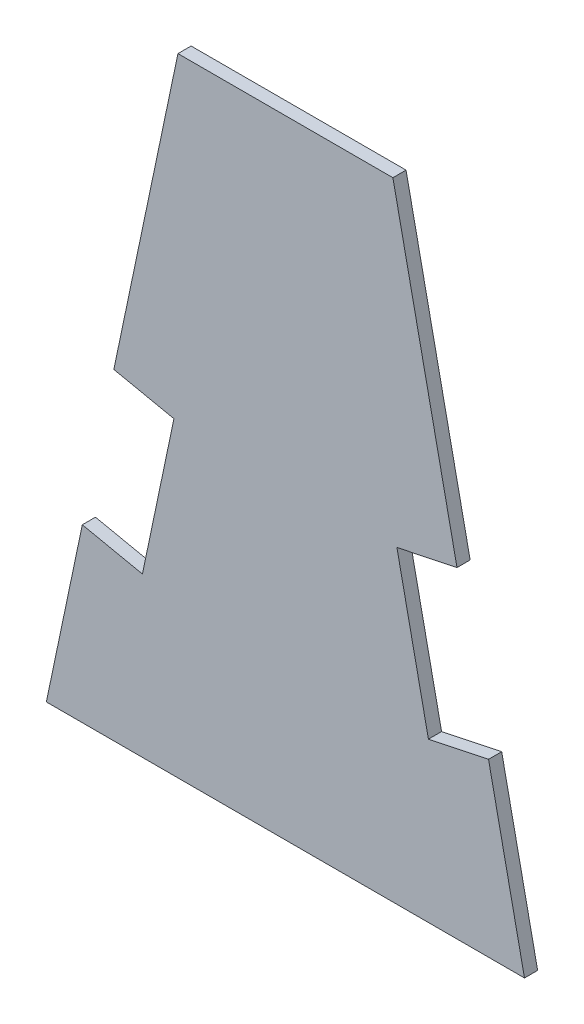
ISO-10303-21;
HEADER;
FILE_DESCRIPTION(('STEP AP214'),'2;1');
FILE_NAME('part.step','',(''),(''),'','','');
FILE_SCHEMA(('AUTOMOTIVE_DESIGN { 1 0 10303 214 1 1 1 1 }'));
ENDSEC;
DATA;
#1=APPLICATION_CONTEXT('core data for automotive mechanical design processes');
#2=APPLICATION_PROTOCOL_DEFINITION('international standard','automotive_design',2000,#1);
#3=PRODUCT_CONTEXT('',#1,'mechanical');
#4=PRODUCT('Part','Part','',(#3));
#5=PRODUCT_RELATED_PRODUCT_CATEGORY('part','',(#4));
#6=PRODUCT_DEFINITION_FORMATION('','',#4);
#7=PRODUCT_DEFINITION_CONTEXT('part definition',#1,'design');
#8=PRODUCT_DEFINITION('design','',#6,#7);
#9=PRODUCT_DEFINITION_SHAPE('','',#8);
#10=(LENGTH_UNIT() NAMED_UNIT(*) SI_UNIT(.MILLI.,.METRE.));
#11=(NAMED_UNIT(*) PLANE_ANGLE_UNIT() SI_UNIT($,.RADIAN.));
#12=(NAMED_UNIT(*) SI_UNIT($,.STERADIAN.) SOLID_ANGLE_UNIT());
#13=UNCERTAINTY_MEASURE_WITH_UNIT(LENGTH_MEASURE(1.E-05),#10,'distance_accuracy_value','');
#14=(GEOMETRIC_REPRESENTATION_CONTEXT(3) GLOBAL_UNCERTAINTY_ASSIGNED_CONTEXT((#13)) GLOBAL_UNIT_ASSIGNED_CONTEXT((#10,
#11,#12)) REPRESENTATION_CONTEXT('',''));
#15=CARTESIAN_POINT('',(0.,0.,0.));
#16=DIRECTION('',(0.,0.,1.));
#17=DIRECTION('',(1.,0.,0.));
#18=AXIS2_PLACEMENT_3D('',#15,#16,#17);
#19=CARTESIAN_POINT('',(79.9136019874139,70.4591111968738,3.));
#20=DIRECTION('',(-0.20532058174959,0.97869477300638,0.));
#21=DIRECTION('',(-0.97869477300638,-0.20532058174959,0.));
#22=AXIS2_PLACEMENT_3D('',#19,#20,#21);
#23=PLANE('',#22);
#24=DIRECTION('',(0.97869477300638,0.20532058174959,0.));
#25=VECTOR('',#24,1.);
#26=CARTESIAN_POINT('',(79.9136019874139,70.4591111968738,0.));
#27=LINE('',#26,#25);
#28=CARTESIAN_POINT('',(79.9136019874139,70.4591111968738,0.));
#29=VERTEX_POINT('',#28);
#30=CARTESIAN_POINT('',(93.6153288095032,73.3335993413681,0.));
#31=VERTEX_POINT('',#30);
#32=EDGE_CURVE('E157',#29,#31,#27,.T.);
#33=ORIENTED_EDGE('',*,*,#32,.T.);
#34=DIRECTION('',(0.,0.,-1.));
#35=VECTOR('',#34,1.);
#36=CARTESIAN_POINT('',(93.6153288095032,73.3335993413681,3.));
#37=LINE('',#36,#35);
#38=CARTESIAN_POINT('',(93.6153288095032,73.3335993413681,3.));
#39=VERTEX_POINT('',#38);
#40=EDGE_CURVE('E11',#39,#31,#37,.T.);
#41=ORIENTED_EDGE('',*,*,#40,.F.);
#42=DIRECTION('',(0.97869477300638,0.20532058174959,0.));
#43=VECTOR('',#42,1.);
#44=CARTESIAN_POINT('',(79.9136019874139,70.4591111968738,3.));
#45=LINE('',#44,#43);
#46=CARTESIAN_POINT('',(79.9136019874139,70.4591111968738,3.));
#47=VERTEX_POINT('',#46);
#48=EDGE_CURVE('E183',#47,#39,#45,.T.);
#49=ORIENTED_EDGE('',*,*,#48,.F.);
#50=DIRECTION('',(0.,0.,-1.));
#51=VECTOR('',#50,1.);
#52=CARTESIAN_POINT('',(79.9136019874139,70.4591111968738,3.));
#53=LINE('',#52,#51);
#54=EDGE_CURVE('E153',#47,#29,#53,.T.);
#55=ORIENTED_EDGE('',*,*,#54,.T.);
#56=EDGE_LOOP('',(#33,#41,#49,#55));
#57=FACE_BOUND('',#56,.T.);
#58=ADVANCED_FACE('F37',(#57),#23,.F.);
#59=CARTESIAN_POINT('',(93.6153288095032,73.3335993413681,3.));
#60=DIRECTION('',(-0.97869477300638,-0.205320581749591,0.));
#61=DIRECTION('',(0.205320581749591,-0.97869477300638,0.));
#62=AXIS2_PLACEMENT_3D('',#59,#60,#61);
#63=PLANE('',#62);
#64=DIRECTION('',(-0.205320581749591,0.97869477300638,0.));
#65=VECTOR('',#64,1.);
#66=CARTESIAN_POINT('',(93.6153288095032,73.3335993413681,0.));
#67=LINE('',#66,#65);
#68=CARTESIAN_POINT('',(79.,143.,0.));
#69=VERTEX_POINT('',#68);
#70=EDGE_CURVE('E160',#31,#69,#67,.T.);
#71=ORIENTED_EDGE('',*,*,#70,.T.);
#72=DIRECTION('',(0.,0.,-1.));
#73=VECTOR('',#72,1.);
#74=CARTESIAN_POINT('',(79.,143.,3.));
#75=LINE('',#74,#73);
#76=CARTESIAN_POINT('',(79.,143.,3.));
#77=VERTEX_POINT('',#76);
#78=EDGE_CURVE('E45',#77,#69,#75,.T.);
#79=ORIENTED_EDGE('',*,*,#78,.F.);
#80=DIRECTION('',(-0.205320581749591,0.97869477300638,0.));
#81=VECTOR('',#80,1.);
#82=CARTESIAN_POINT('',(93.6153288095032,73.3335993413681,3.));
#83=LINE('',#82,#81);
#84=EDGE_CURVE('E108',#39,#77,#83,.T.);
#85=ORIENTED_EDGE('',*,*,#84,.F.);
#86=ORIENTED_EDGE('',*,*,#40,.T.);
#87=EDGE_LOOP('',(#71,#79,#85,#86));
#88=FACE_BOUND('',#87,.T.);
#89=ADVANCED_FACE('F256',(#88),#63,.F.);
#90=CARTESIAN_POINT('',(79.,143.,3.));
#91=DIRECTION('',(0.,-1.,0.));
#92=DIRECTION('',(0.,0.,-1.));
#93=AXIS2_PLACEMENT_3D('',#90,#91,#92);
#94=PLANE('',#93);
#95=DIRECTION('',(-1.,0.,0.));
#96=VECTOR('',#95,1.);
#97=CARTESIAN_POINT('',(79.,143.,0.));
#98=LINE('',#97,#96);
#99=CARTESIAN_POINT('',(30.,143.,0.));
#100=VERTEX_POINT('',#99);
#101=EDGE_CURVE('E162',#69,#100,#98,.T.);
#102=ORIENTED_EDGE('',*,*,#101,.T.);
#103=DIRECTION('',(0.,0.,-1.));
#104=VECTOR('',#103,1.);
#105=CARTESIAN_POINT('',(30.,143.,3.));
#106=LINE('',#105,#104);
#107=CARTESIAN_POINT('',(30.,143.,3.));
#108=VERTEX_POINT('',#107);
#109=EDGE_CURVE('E198',#108,#100,#106,.T.);
#110=ORIENTED_EDGE('',*,*,#109,.F.);
#111=DIRECTION('',(-1.,0.,0.));
#112=VECTOR('',#111,1.);
#113=CARTESIAN_POINT('',(79.,143.,3.));
#114=LINE('',#113,#112);
#115=EDGE_CURVE('E206',#77,#108,#114,.T.);
#116=ORIENTED_EDGE('',*,*,#115,.F.);
#117=ORIENTED_EDGE('',*,*,#78,.T.);
#118=EDGE_LOOP('',(#102,#110,#116,#117));
#119=FACE_BOUND('',#118,.T.);
#120=ADVANCED_FACE('F204',(#119),#94,.F.);
#121=CARTESIAN_POINT('',(30.,143.,3.));
#122=DIRECTION('',(0.97869477300638,-0.20532058174959,0.));
#123=DIRECTION('',(0.20532058174959,0.97869477300638,0.));
#124=AXIS2_PLACEMENT_3D('',#121,#122,#123);
#125=PLANE('',#124);
#126=DIRECTION('',(-0.205320581749591,-0.97869477300638,0.));
#127=VECTOR('',#126,1.);
#128=CARTESIAN_POINT('',(30.,143.,0.));
#129=LINE('',#128,#127);
#130=CARTESIAN_POINT('',(15.3846711904967,73.333599341368,0.));
#131=VERTEX_POINT('',#130);
#132=EDGE_CURVE('E164',#100,#131,#129,.T.);
#133=ORIENTED_EDGE('',*,*,#132,.T.);
#134=DIRECTION('',(0.,0.,-1.));
#135=VECTOR('',#134,1.);
#136=CARTESIAN_POINT('',(15.3846711904967,73.333599341368,3.));
#137=LINE('',#136,#135);
#138=CARTESIAN_POINT('',(15.3846711904967,73.333599341368,3.));
#139=VERTEX_POINT('',#138);
#140=EDGE_CURVE('E196',#139,#131,#137,.T.);
#141=ORIENTED_EDGE('',*,*,#140,.F.);
#142=DIRECTION('',(-0.205320581749591,-0.97869477300638,0.));
#143=VECTOR('',#142,1.);
#144=CARTESIAN_POINT('',(30.,143.,3.));
#145=LINE('',#144,#143);
#146=EDGE_CURVE('E217',#108,#139,#145,.T.);
#147=ORIENTED_EDGE('',*,*,#146,.F.);
#148=ORIENTED_EDGE('',*,*,#109,.T.);
#149=EDGE_LOOP('',(#133,#141,#147,#148));
#150=FACE_BOUND('',#149,.T.);
#151=ADVANCED_FACE('F214',(#150),#125,.F.);
#152=CARTESIAN_POINT('',(29.0863980125861,70.4591111968738,3.));
#153=DIRECTION('',(-0.205320581749589,-0.97869477300638,0.));
#154=DIRECTION('',(0.978694773006381,-0.205320581749589,0.));
#155=AXIS2_PLACEMENT_3D('',#152,#153,#154);
#156=PLANE('',#155);
#157=DIRECTION('',(-0.97869477300638,0.205320581749589,0.));
#158=VECTOR('',#157,1.);
#159=CARTESIAN_POINT('',(29.0863980125861,70.4591111968738,0.));
#160=LINE('',#159,#158);
#161=CARTESIAN_POINT('',(29.0863980125861,70.4591111968738,0.));
#162=VERTEX_POINT('',#161);
#163=EDGE_CURVE('E167',#162,#131,#160,.T.);
#164=ORIENTED_EDGE('',*,*,#163,.F.);
#165=DIRECTION('',(0.,0.,-1.));
#166=VECTOR('',#165,1.);
#167=CARTESIAN_POINT('',(29.0863980125861,70.4591111968738,3.));
#168=LINE('',#167,#166);
#169=CARTESIAN_POINT('',(29.0863980125861,70.4591111968738,3.));
#170=VERTEX_POINT('',#169);
#171=EDGE_CURVE('E194',#170,#162,#168,.T.);
#172=ORIENTED_EDGE('',*,*,#171,.F.);
#173=DIRECTION('',(-0.97869477300638,0.205320581749589,0.));
#174=VECTOR('',#173,1.);
#175=CARTESIAN_POINT('',(29.0863980125861,70.4591111968738,3.));
#176=LINE('',#175,#174);
#177=EDGE_CURVE('E219',#170,#139,#176,.T.);
#178=ORIENTED_EDGE('',*,*,#177,.T.);
#179=ORIENTED_EDGE('',*,*,#140,.T.);
#180=EDGE_LOOP('',(#164,#172,#178,#179));
#181=FACE_BOUND('',#180,.T.);
#182=ADVANCED_FACE('F267',(#181),#156,.T.);
#183=CARTESIAN_POINT('',(21.9001776513504,36.2047941416505,3.));
#184=DIRECTION('',(-0.97869477300638,0.20532058174959,0.));
#185=DIRECTION('',(-0.20532058174959,-0.97869477300638,0.));
#186=AXIS2_PLACEMENT_3D('',#183,#184,#185);
#187=PLANE('',#186);
#188=DIRECTION('',(0.20532058174959,0.97869477300638,0.));
#189=VECTOR('',#188,1.);
#190=CARTESIAN_POINT('',(21.9001776513504,36.2047941416505,0.));
#191=LINE('',#190,#189);
#192=CARTESIAN_POINT('',(21.9001776513504,36.2047941416505,0.));
#193=VERTEX_POINT('',#192);
#194=EDGE_CURVE('E170',#193,#162,#191,.T.);
#195=ORIENTED_EDGE('',*,*,#194,.F.);
#196=DIRECTION('',(0.,0.,-1.));
#197=VECTOR('',#196,1.);
#198=CARTESIAN_POINT('',(21.9001776513504,36.2047941416505,3.));
#199=LINE('',#198,#197);
#200=CARTESIAN_POINT('',(21.9001776513504,36.2047941416505,3.));
#201=VERTEX_POINT('',#200);
#202=EDGE_CURVE('E192',#201,#193,#199,.T.);
#203=ORIENTED_EDGE('',*,*,#202,.F.);
#204=DIRECTION('',(0.20532058174959,0.97869477300638,0.));
#205=VECTOR('',#204,1.);
#206=CARTESIAN_POINT('',(21.9001776513504,36.2047941416505,3.));
#207=LINE('',#206,#205);
#208=EDGE_CURVE('E221',#201,#170,#207,.T.);
#209=ORIENTED_EDGE('',*,*,#208,.T.);
#210=ORIENTED_EDGE('',*,*,#171,.T.);
#211=EDGE_LOOP('',(#195,#203,#209,#210));
#212=FACE_BOUND('',#211,.T.);
#213=ADVANCED_FACE('F270',(#212),#187,.T.);
#214=CARTESIAN_POINT('',(8.1984508292611,39.0792822861448,3.));
#215=DIRECTION('',(0.20532058174959,0.97869477300638,0.));
#216=DIRECTION('',(-0.97869477300638,0.20532058174959,0.));
#217=AXIS2_PLACEMENT_3D('',#214,#215,#216);
#218=PLANE('',#217);
#219=DIRECTION('',(0.97869477300638,-0.20532058174959,0.));
#220=VECTOR('',#219,1.);
#221=CARTESIAN_POINT('',(8.1984508292611,39.0792822861448,0.));
#222=LINE('',#221,#220);
#223=CARTESIAN_POINT('',(8.1984508292611,39.0792822861448,0.));
#224=VERTEX_POINT('',#223);
#225=EDGE_CURVE('E173',#224,#193,#222,.T.);
#226=ORIENTED_EDGE('',*,*,#225,.F.);
#227=DIRECTION('',(0.,0.,-1.));
#228=VECTOR('',#227,1.);
#229=CARTESIAN_POINT('',(8.1984508292611,39.0792822861448,3.));
#230=LINE('',#229,#228);
#231=CARTESIAN_POINT('',(8.1984508292611,39.0792822861448,3.));
#232=VERTEX_POINT('',#231);
#233=EDGE_CURVE('E190',#232,#224,#230,.T.);
#234=ORIENTED_EDGE('',*,*,#233,.F.);
#235=DIRECTION('',(0.97869477300638,-0.20532058174959,0.));
#236=VECTOR('',#235,1.);
#237=CARTESIAN_POINT('',(8.1984508292611,39.0792822861448,3.));
#238=LINE('',#237,#236);
#239=EDGE_CURVE('E228',#232,#201,#238,.T.);
#240=ORIENTED_EDGE('',*,*,#239,.T.);
#241=ORIENTED_EDGE('',*,*,#202,.T.);
#242=EDGE_LOOP('',(#226,#234,#240,#241));
#243=FACE_BOUND('',#242,.T.);
#244=ADVANCED_FACE('F274',(#243),#218,.T.);
#245=CARTESIAN_POINT('',(8.1984508292611,39.0792822861448,3.));
#246=DIRECTION('',(0.97869477300638,-0.205320581749589,0.));
#247=DIRECTION('',(0.205320581749589,0.97869477300638,0.));
#248=AXIS2_PLACEMENT_3D('',#245,#246,#247);
#249=PLANE('',#248);
#250=DIRECTION('',(-0.205320581749589,-0.97869477300638,0.));
#251=VECTOR('',#250,1.);
#252=CARTESIAN_POINT('',(8.1984508292611,39.0792822861448,0.));
#253=LINE('',#252,#251);
#254=CARTESIAN_POINT('',(0.,0.,0.));
#255=VERTEX_POINT('',#254);
#256=EDGE_CURVE('E176',#224,#255,#253,.T.);
#257=ORIENTED_EDGE('',*,*,#256,.T.);
#258=DIRECTION('',(0.,0.,-1.));
#259=VECTOR('',#258,1.);
#260=CARTESIAN_POINT('',(0.,0.,3.));
#261=LINE('',#260,#259);
#262=CARTESIAN_POINT('',(0.,0.,3.));
#263=VERTEX_POINT('',#262);
#264=EDGE_CURVE('E187',#263,#255,#261,.T.);
#265=ORIENTED_EDGE('',*,*,#264,.F.);
#266=DIRECTION('',(-0.205320581749589,-0.97869477300638,0.));
#267=VECTOR('',#266,1.);
#268=CARTESIAN_POINT('',(8.1984508292611,39.0792822861448,3.));
#269=LINE('',#268,#267);
#270=EDGE_CURVE('E231',#232,#263,#269,.T.);
#271=ORIENTED_EDGE('',*,*,#270,.F.);
#272=ORIENTED_EDGE('',*,*,#233,.T.);
#273=EDGE_LOOP('',(#257,#265,#271,#272));
#274=FACE_BOUND('',#273,.T.);
#275=ADVANCED_FACE('F237',(#274),#249,.F.);
#276=CARTESIAN_POINT('',(0.,0.,3.));
#277=DIRECTION('',(0.,1.,0.));
#278=DIRECTION('',(0.,0.,1.));
#279=AXIS2_PLACEMENT_3D('',#276,#277,#278);
#280=PLANE('',#279);
#281=DIRECTION('',(1.,0.,0.));
#282=VECTOR('',#281,1.);
#283=CARTESIAN_POINT('',(0.,0.,0.));
#284=LINE('',#283,#282);
#285=CARTESIAN_POINT('',(109.,0.,0.));
#286=VERTEX_POINT('',#285);
#287=EDGE_CURVE('E178',#255,#286,#284,.T.);
#288=ORIENTED_EDGE('',*,*,#287,.T.);
#289=DIRECTION('',(0.,0.,-1.));
#290=VECTOR('',#289,1.);
#291=CARTESIAN_POINT('',(109.,0.,3.));
#292=LINE('',#291,#290);
#293=CARTESIAN_POINT('',(109.,0.,3.));
#294=VERTEX_POINT('',#293);
#295=EDGE_CURVE('E148',#294,#286,#292,.T.);
#296=ORIENTED_EDGE('',*,*,#295,.F.);
#297=DIRECTION('',(1.,0.,0.));
#298=VECTOR('',#297,1.);
#299=CARTESIAN_POINT('',(0.,0.,3.));
#300=LINE('',#299,#298);
#301=EDGE_CURVE('E139',#263,#294,#300,.T.);
#302=ORIENTED_EDGE('',*,*,#301,.F.);
#303=ORIENTED_EDGE('',*,*,#264,.T.);
#304=EDGE_LOOP('',(#288,#296,#302,#303));
#305=FACE_BOUND('',#304,.T.);
#306=ADVANCED_FACE('F241',(#305),#280,.F.);
#307=CARTESIAN_POINT('',(109.,0.,3.));
#308=DIRECTION('',(-0.97869477300638,-0.20532058174959,0.));
#309=DIRECTION('',(0.20532058174959,-0.97869477300638,0.));
#310=AXIS2_PLACEMENT_3D('',#307,#308,#309);
#311=PLANE('',#310);
#312=DIRECTION('',(-0.20532058174959,0.97869477300638,0.));
#313=VECTOR('',#312,1.);
#314=CARTESIAN_POINT('',(109.,0.,0.));
#315=LINE('',#314,#313);
#316=CARTESIAN_POINT('',(100.801549170739,39.0792822861448,0.));
#317=VERTEX_POINT('',#316);
#318=EDGE_CURVE('E147',#286,#317,#315,.T.);
#319=ORIENTED_EDGE('',*,*,#318,.T.);
#320=DIRECTION('',(0.,0.,-1.));
#321=VECTOR('',#320,1.);
#322=CARTESIAN_POINT('',(100.801549170739,39.0792822861448,3.));
#323=LINE('',#322,#321);
#324=CARTESIAN_POINT('',(100.801549170739,39.0792822861448,3.));
#325=VERTEX_POINT('',#324);
#326=EDGE_CURVE('E144',#325,#317,#323,.T.);
#327=ORIENTED_EDGE('',*,*,#326,.F.);
#328=DIRECTION('',(-0.20532058174959,0.97869477300638,0.));
#329=VECTOR('',#328,1.);
#330=CARTESIAN_POINT('',(109.,0.,3.));
#331=LINE('',#330,#329);
#332=EDGE_CURVE('E133',#294,#325,#331,.T.);
#333=ORIENTED_EDGE('',*,*,#332,.F.);
#334=ORIENTED_EDGE('',*,*,#295,.T.);
#335=EDGE_LOOP('',(#319,#327,#333,#334));
#336=FACE_BOUND('',#335,.T.);
#337=ADVANCED_FACE('F145',(#336),#311,.F.);
#338=CARTESIAN_POINT('',(100.801549170739,39.0792822861448,3.));
#339=DIRECTION('',(0.205320581749591,-0.97869477300638,0.));
#340=DIRECTION('',(0.97869477300638,0.205320581749591,0.));
#341=AXIS2_PLACEMENT_3D('',#338,#339,#340);
#342=PLANE('',#341);
#343=DIRECTION('',(-0.97869477300638,-0.205320581749591,0.));
#344=VECTOR('',#343,1.);
#345=CARTESIAN_POINT('',(100.801549170739,39.0792822861448,0.));
#346=LINE('',#345,#344);
#347=CARTESIAN_POINT('',(87.0998223486496,36.2047941416505,0.));
#348=VERTEX_POINT('',#347);
#349=EDGE_CURVE('E94',#317,#348,#346,.T.);
#350=ORIENTED_EDGE('',*,*,#349,.T.);
#351=DIRECTION('',(0.,0.,-1.));
#352=VECTOR('',#351,1.);
#353=CARTESIAN_POINT('',(87.0998223486496,36.2047941416505,3.));
#354=LINE('',#353,#352);
#355=CARTESIAN_POINT('',(87.0998223486496,36.2047941416505,3.));
#356=VERTEX_POINT('',#355);
#357=EDGE_CURVE('E149',#356,#348,#354,.T.);
#358=ORIENTED_EDGE('',*,*,#357,.F.);
#359=DIRECTION('',(-0.97869477300638,-0.205320581749591,0.));
#360=VECTOR('',#359,1.);
#361=CARTESIAN_POINT('',(100.801549170739,39.0792822861448,3.));
#362=LINE('',#361,#360);
#363=EDGE_CURVE('E137',#325,#356,#362,.T.);
#364=ORIENTED_EDGE('',*,*,#363,.F.);
#365=ORIENTED_EDGE('',*,*,#326,.T.);
#366=EDGE_LOOP('',(#350,#358,#364,#365));
#367=FACE_BOUND('',#366,.T.);
#368=ADVANCED_FACE('F151',(#367),#342,.F.);
#369=CARTESIAN_POINT('',(87.0998223486496,36.2047941416505,3.));
#370=DIRECTION('',(-0.97869477300638,-0.20532058174959,0.));
#371=DIRECTION('',(0.20532058174959,-0.97869477300638,0.));
#372=AXIS2_PLACEMENT_3D('',#369,#370,#371);
#373=PLANE('',#372);
#374=DIRECTION('',(-0.20532058174959,0.97869477300638,0.));
#375=VECTOR('',#374,1.);
#376=CARTESIAN_POINT('',(87.0998223486496,36.2047941416505,0.));
#377=LINE('',#376,#375);
#378=EDGE_CURVE('E100',#348,#29,#377,.T.);
#379=ORIENTED_EDGE('',*,*,#378,.T.);
#380=ORIENTED_EDGE('',*,*,#54,.F.);
#381=DIRECTION('',(-0.20532058174959,0.97869477300638,0.));
#382=VECTOR('',#381,1.);
#383=CARTESIAN_POINT('',(87.0998223486496,36.2047941416505,3.));
#384=LINE('',#383,#382);
#385=EDGE_CURVE('E53',#356,#47,#384,.T.);
#386=ORIENTED_EDGE('',*,*,#385,.F.);
#387=ORIENTED_EDGE('',*,*,#357,.T.);
#388=EDGE_LOOP('',(#379,#380,#386,#387));
#389=FACE_BOUND('',#388,.T.);
#390=ADVANCED_FACE('F245',(#389),#373,.F.);
#391=CARTESIAN_POINT('',(0.,0.,3.));
#392=DIRECTION('',(0.,0.,1.));
#393=DIRECTION('',(1.,0.,0.));
#394=AXIS2_PLACEMENT_3D('',#391,#392,#393);
#395=PLANE('',#394);
#396=ORIENTED_EDGE('',*,*,#48,.T.);
#397=ORIENTED_EDGE('',*,*,#84,.T.);
#398=ORIENTED_EDGE('',*,*,#115,.T.);
#399=ORIENTED_EDGE('',*,*,#146,.T.);
#400=ORIENTED_EDGE('',*,*,#177,.F.);
#401=ORIENTED_EDGE('',*,*,#208,.F.);
#402=ORIENTED_EDGE('',*,*,#239,.F.);
#403=ORIENTED_EDGE('',*,*,#270,.T.);
#404=ORIENTED_EDGE('',*,*,#301,.T.);
#405=ORIENTED_EDGE('',*,*,#332,.T.);
#406=ORIENTED_EDGE('',*,*,#363,.T.);
#407=ORIENTED_EDGE('',*,*,#385,.T.);
#408=EDGE_LOOP('',(#396,#397,#398,#399,#400,#401,#402,#403,#404,#405,#406,#407));
#409=FACE_BOUND('',#408,.T.);
#410=ADVANCED_FACE('F135',(#409),#395,.T.);
#411=CARTESIAN_POINT('',(0.,0.,0.));
#412=DIRECTION('',(0.,0.,1.));
#413=DIRECTION('',(1.,0.,0.));
#414=AXIS2_PLACEMENT_3D('',#411,#412,#413);
#415=PLANE('',#414);
#416=ORIENTED_EDGE('',*,*,#32,.F.);
#417=ORIENTED_EDGE('',*,*,#378,.F.);
#418=ORIENTED_EDGE('',*,*,#349,.F.);
#419=ORIENTED_EDGE('',*,*,#318,.F.);
#420=ORIENTED_EDGE('',*,*,#287,.F.);
#421=ORIENTED_EDGE('',*,*,#256,.F.);
#422=ORIENTED_EDGE('',*,*,#225,.T.);
#423=ORIENTED_EDGE('',*,*,#194,.T.);
#424=ORIENTED_EDGE('',*,*,#163,.T.);
#425=ORIENTED_EDGE('',*,*,#132,.F.);
#426=ORIENTED_EDGE('',*,*,#101,.F.);
#427=ORIENTED_EDGE('',*,*,#70,.F.);
#428=EDGE_LOOP('',(#416,#417,#418,#419,#420,#421,#422,#423,#424,#425,#426,#427));
#429=FACE_BOUND('',#428,.T.);
#430=ADVANCED_FACE('F210',(#429),#415,.F.);
#431=CLOSED_SHELL('',(#58,#89,#120,#151,#182,#213,#244,#275,#306,#337,#368,#390,#410,#430));
#432=MANIFOLD_SOLID_BREP('B2',#431);
#433=ADVANCED_BREP_SHAPE_REPRESENTATION('',(#18,#432),#14);
#434=SHAPE_DEFINITION_REPRESENTATION(#9,#433);
ENDSEC;
END-ISO-10303-21;
